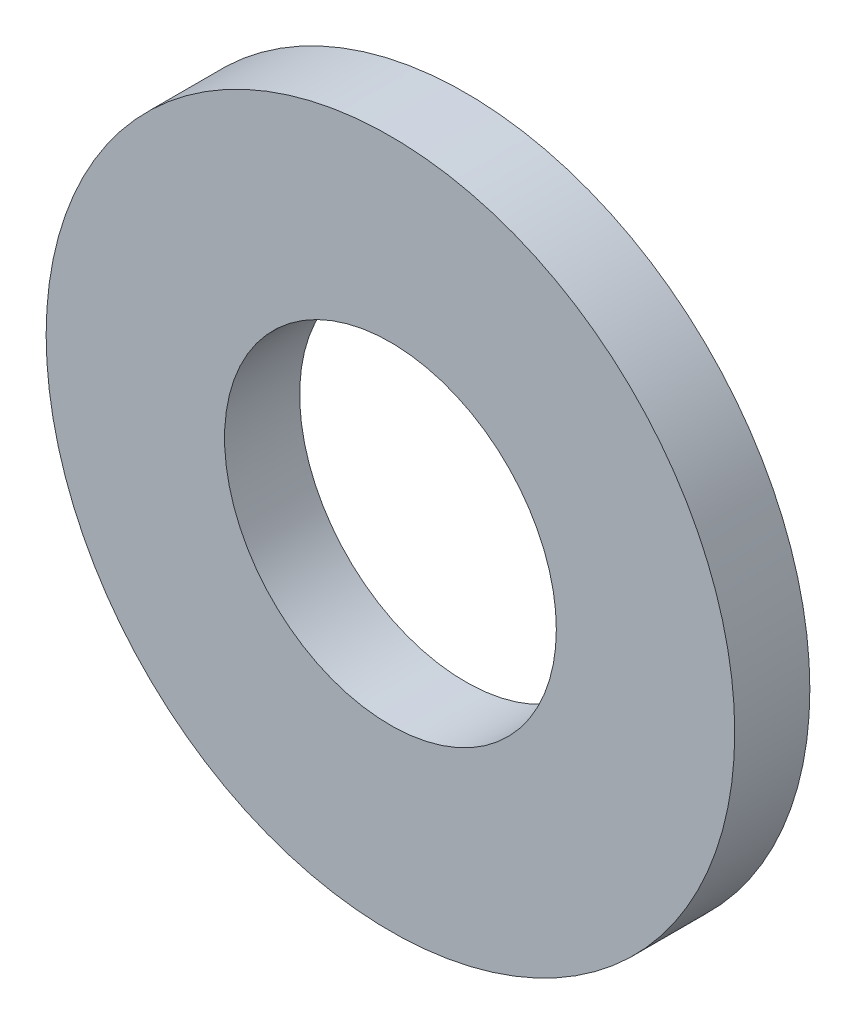
ISO-10303-21;
HEADER;
FILE_DESCRIPTION(('STEP AP214'),'2;1');
FILE_NAME('part.step','',(''),(''),'','','');
FILE_SCHEMA(('AUTOMOTIVE_DESIGN { 1 0 10303 214 1 1 1 1 }'));
ENDSEC;
DATA;
#1=APPLICATION_CONTEXT('core data for automotive mechanical design processes');
#2=APPLICATION_PROTOCOL_DEFINITION('international standard','automotive_design',2000,#1);
#3=PRODUCT_CONTEXT('',#1,'mechanical');
#4=PRODUCT('Part','Part','',(#3));
#5=PRODUCT_RELATED_PRODUCT_CATEGORY('part','',(#4));
#6=PRODUCT_DEFINITION_FORMATION('','',#4);
#7=PRODUCT_DEFINITION_CONTEXT('part definition',#1,'design');
#8=PRODUCT_DEFINITION('design','',#6,#7);
#9=PRODUCT_DEFINITION_SHAPE('','',#8);
#10=(LENGTH_UNIT() NAMED_UNIT(*) SI_UNIT(.MILLI.,.METRE.));
#11=(NAMED_UNIT(*) PLANE_ANGLE_UNIT() SI_UNIT($,.RADIAN.));
#12=(NAMED_UNIT(*) SI_UNIT($,.STERADIAN.) SOLID_ANGLE_UNIT());
#13=UNCERTAINTY_MEASURE_WITH_UNIT(LENGTH_MEASURE(1.E-05),#10,'distance_accuracy_value','');
#14=(GEOMETRIC_REPRESENTATION_CONTEXT(3) GLOBAL_UNCERTAINTY_ASSIGNED_CONTEXT((#13)) GLOBAL_UNIT_ASSIGNED_CONTEXT((#10,
#11,#12)) REPRESENTATION_CONTEXT('',''));
#15=CARTESIAN_POINT('',(0.,0.,0.));
#16=DIRECTION('',(0.,0.,1.));
#17=DIRECTION('',(1.,0.,0.));
#18=AXIS2_PLACEMENT_3D('',#15,#16,#17);
#19=CARTESIAN_POINT('',(0.,0.,1.2));
#20=DIRECTION('',(0.,0.,1.));
#21=DIRECTION('',(1.,0.,0.));
#22=AXIS2_PLACEMENT_3D('',#19,#20,#21);
#23=PLANE('',#22);
#24=CARTESIAN_POINT('',(0.,0.,1.2));
#25=DIRECTION('',(0.,0.,1.));
#26=DIRECTION('',(1.,0.,0.));
#27=AXIS2_PLACEMENT_3D('',#24,#25,#26);
#28=CIRCLE('',#27,5.5);
#29=CARTESIAN_POINT('',(5.5,0.,1.2));
#30=VERTEX_POINT('',#29);
#31=EDGE_CURVE('E10',#30,#30,#28,.T.);
#32=ORIENTED_EDGE('',*,*,#31,.T.);
#33=EDGE_LOOP('',(#32));
#34=FACE_BOUND('',#33,.T.);
#35=CARTESIAN_POINT('',(0.,0.,1.2));
#36=DIRECTION('',(0.,0.,1.));
#37=DIRECTION('',(1.,0.,0.));
#38=AXIS2_PLACEMENT_3D('',#35,#36,#37);
#39=CIRCLE('',#38,2.65);
#40=CARTESIAN_POINT('',(2.65,0.,1.2));
#41=VERTEX_POINT('',#40);
#42=EDGE_CURVE('E41',#41,#41,#39,.T.);
#43=ORIENTED_EDGE('',*,*,#42,.F.);
#44=EDGE_LOOP('',(#43));
#45=FACE_BOUND('',#44,.T.);
#46=ADVANCED_FACE('F30',(#34,#45),#23,.T.);
#47=CARTESIAN_POINT('',(0.,0.,0.));
#48=DIRECTION('',(0.,0.,1.));
#49=DIRECTION('',(1.,0.,0.));
#50=AXIS2_PLACEMENT_3D('',#47,#48,#49);
#51=PLANE('',#50);
#52=CARTESIAN_POINT('',(0.,0.,0.));
#53=DIRECTION('',(0.,0.,1.));
#54=DIRECTION('',(1.,0.,0.));
#55=AXIS2_PLACEMENT_3D('',#52,#53,#54);
#56=CIRCLE('',#55,5.5);
#57=CARTESIAN_POINT('',(5.5,0.,0.));
#58=VERTEX_POINT('',#57);
#59=EDGE_CURVE('E34',#58,#58,#56,.T.);
#60=ORIENTED_EDGE('',*,*,#59,.F.);
#61=EDGE_LOOP('',(#60));
#62=FACE_BOUND('',#61,.T.);
#63=CARTESIAN_POINT('',(0.,0.,0.));
#64=DIRECTION('',(0.,0.,1.));
#65=DIRECTION('',(1.,0.,0.));
#66=AXIS2_PLACEMENT_3D('',#63,#64,#65);
#67=CIRCLE('',#66,2.65);
#68=CARTESIAN_POINT('',(2.65,0.,0.));
#69=VERTEX_POINT('',#68);
#70=EDGE_CURVE('E43',#69,#69,#67,.T.);
#71=ORIENTED_EDGE('',*,*,#70,.T.);
#72=EDGE_LOOP('',(#71));
#73=FACE_BOUND('',#72,.T.);
#74=ADVANCED_FACE('F53',(#62,#73),#51,.F.);
#75=CARTESIAN_POINT('',(0.,0.,1.2));
#76=DIRECTION('',(0.,0.,-1.));
#77=DIRECTION('',(-1.,0.,0.));
#78=AXIS2_PLACEMENT_3D('',#75,#76,#77);
#79=CYLINDRICAL_SURFACE('',#78,5.5);
#80=ORIENTED_EDGE('',*,*,#31,.F.);
#81=EDGE_LOOP('',(#80));
#82=FACE_BOUND('',#81,.T.);
#83=ORIENTED_EDGE('',*,*,#59,.T.);
#84=EDGE_LOOP('',(#83));
#85=FACE_BOUND('',#84,.T.);
#86=ADVANCED_FACE('F32',(#82,#85),#79,.T.);
#87=CARTESIAN_POINT('',(0.,0.,1.2));
#88=DIRECTION('',(0.,0.,-1.));
#89=DIRECTION('',(-1.,0.,0.));
#90=AXIS2_PLACEMENT_3D('',#87,#88,#89);
#91=CYLINDRICAL_SURFACE('',#90,2.65);
#92=ORIENTED_EDGE('',*,*,#42,.T.);
#93=EDGE_LOOP('',(#92));
#94=FACE_BOUND('',#93,.T.);
#95=ORIENTED_EDGE('',*,*,#70,.F.);
#96=EDGE_LOOP('',(#95));
#97=FACE_BOUND('',#96,.T.);
#98=ADVANCED_FACE('F49',(#94,#97),#91,.F.);
#99=CLOSED_SHELL('',(#46,#74,#86,#98));
#100=MANIFOLD_SOLID_BREP('B2',#99);
#101=ADVANCED_BREP_SHAPE_REPRESENTATION('',(#18,#100),#14);
#102=SHAPE_DEFINITION_REPRESENTATION(#9,#101);
ENDSEC;
END-ISO-10303-21;
